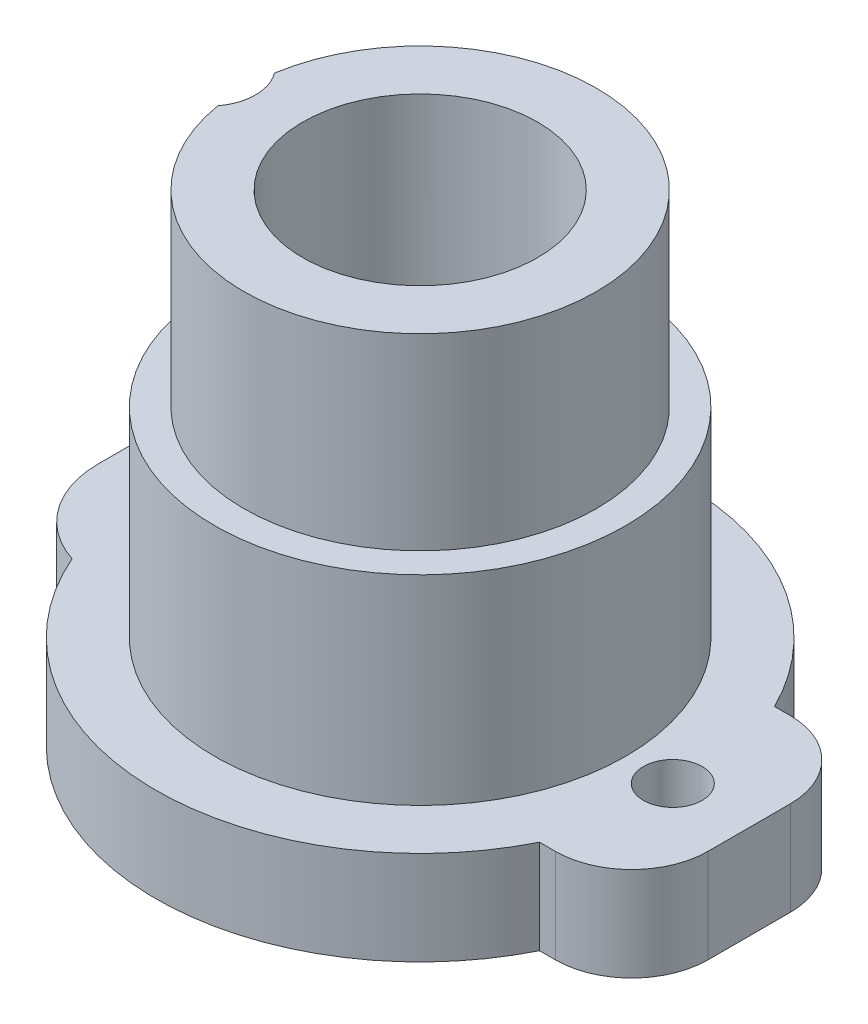
ISO-10303-21;
HEADER;
FILE_DESCRIPTION(('STEP AP214'),'2;1');
FILE_NAME('part.step','',(''),(''),'','','');
FILE_SCHEMA(('AUTOMOTIVE_DESIGN { 1 0 10303 214 1 1 1 1 }'));
ENDSEC;
DATA;
#1=APPLICATION_CONTEXT('core data for automotive mechanical design processes');
#2=APPLICATION_PROTOCOL_DEFINITION('international standard','automotive_design',2000,#1);
#3=PRODUCT_CONTEXT('',#1,'mechanical');
#4=PRODUCT('Part','Part','',(#3));
#5=PRODUCT_RELATED_PRODUCT_CATEGORY('part','',(#4));
#6=PRODUCT_DEFINITION_FORMATION('','',#4);
#7=PRODUCT_DEFINITION_CONTEXT('part definition',#1,'design');
#8=PRODUCT_DEFINITION('design','',#6,#7);
#9=PRODUCT_DEFINITION_SHAPE('','',#8);
#10=(LENGTH_UNIT() NAMED_UNIT(*) SI_UNIT(.MILLI.,.METRE.));
#11=(NAMED_UNIT(*) PLANE_ANGLE_UNIT() SI_UNIT($,.RADIAN.));
#12=(NAMED_UNIT(*) SI_UNIT($,.STERADIAN.) SOLID_ANGLE_UNIT());
#13=UNCERTAINTY_MEASURE_WITH_UNIT(LENGTH_MEASURE(1.E-05),#10,'distance_accuracy_value','');
#14=(GEOMETRIC_REPRESENTATION_CONTEXT(3) GLOBAL_UNCERTAINTY_ASSIGNED_CONTEXT((#13)) GLOBAL_UNIT_ASSIGNED_CONTEXT((#10,
#11,#12)) REPRESENTATION_CONTEXT('',''));
#15=CARTESIAN_POINT('',(0.,0.,0.));
#16=DIRECTION('',(0.,0.,1.));
#17=DIRECTION('',(1.,0.,0.));
#18=AXIS2_PLACEMENT_3D('',#15,#16,#17);
#19=CARTESIAN_POINT('',(0.,-10.,0.));
#20=DIRECTION('',(0.,-1.,0.));
#21=DIRECTION('',(0.,0.,-1.));
#22=AXIS2_PLACEMENT_3D('',#19,#20,#21);
#23=CYLINDRICAL_SURFACE('',#22,35.);
#24=CARTESIAN_POINT('',(0.,16.,0.));
#25=DIRECTION('',(0.,-1.,0.));
#26=DIRECTION('',(0.,0.,-1.));
#27=AXIS2_PLACEMENT_3D('',#24,#25,#26);
#28=CIRCLE('',#27,35.);
#29=CARTESIAN_POINT('',(-34.125,16.,-7.77717011515114));
#30=VERTEX_POINT('',#29);
#31=CARTESIAN_POINT('',(-34.125,16.,7.77717011515116));
#32=VERTEX_POINT('',#31);
#33=EDGE_CURVE('E223',#30,#32,#28,.T.);
#34=ORIENTED_EDGE('',*,*,#33,.F.);
#35=DIRECTION('',(0.,-1.,0.));
#36=VECTOR('',#35,1.);
#37=CARTESIAN_POINT('',(-34.125,41.,-7.77717011515114));
#38=LINE('',#37,#36);
#39=CARTESIAN_POINT('',(-34.125,50.,-7.77717011515114));
#40=VERTEX_POINT('',#39);
#41=EDGE_CURVE('E376',#30,#40,#38,.F.);
#42=ORIENTED_EDGE('',*,*,#41,.T.);
#43=CARTESIAN_POINT('',(0.,50.,0.));
#44=DIRECTION('',(0.,-1.,0.));
#45=DIRECTION('',(0.,0.,-1.));
#46=AXIS2_PLACEMENT_3D('',#43,#44,#45);
#47=CIRCLE('',#46,35.);
#48=CARTESIAN_POINT('',(-34.125,50.,7.77717011515114));
#49=VERTEX_POINT('',#48);
#50=EDGE_CURVE('E216',#40,#49,#47,.T.);
#51=ORIENTED_EDGE('',*,*,#50,.T.);
#52=DIRECTION('',(0.,-1.,0.));
#53=VECTOR('',#52,1.);
#54=CARTESIAN_POINT('',(-34.125,41.,7.77717011515114));
#55=LINE('',#54,#53);
#56=EDGE_CURVE('E382',#49,#32,#55,.T.);
#57=ORIENTED_EDGE('',*,*,#56,.T.);
#58=EDGE_LOOP('',(#34,#42,#51,#57));
#59=FACE_BOUND('',#58,.T.);
#60=ADVANCED_FACE('F54',(#59),#23,.T.);
#61=CARTESIAN_POINT('',(0.,-10.,0.));
#62=DIRECTION('',(0.,-1.,0.));
#63=DIRECTION('',(0.,0.,-1.));
#64=AXIS2_PLACEMENT_3D('',#61,#62,#63);
#65=CYLINDRICAL_SURFACE('',#64,30.);
#66=CARTESIAN_POINT('',(0.,50.,0.));
#67=DIRECTION('',(0.,-1.,0.));
#68=DIRECTION('',(0.,0.,-1.));
#69=AXIS2_PLACEMENT_3D('',#66,#67,#68);
#70=CIRCLE('',#69,30.);
#71=CARTESIAN_POINT('',(-29.6111111111111,50.,-4.81477920214751));
#72=VERTEX_POINT('',#71);
#73=CARTESIAN_POINT('',(-29.6111111111111,50.,4.81477920214752));
#74=VERTEX_POINT('',#73);
#75=EDGE_CURVE('E213',#72,#74,#70,.T.);
#76=ORIENTED_EDGE('',*,*,#75,.F.);
#77=DIRECTION('',(0.,-1.,0.));
#78=VECTOR('',#77,1.);
#79=CARTESIAN_POINT('',(-29.6111111111111,41.,-4.8147792021475));
#80=LINE('',#79,#78);
#81=CARTESIAN_POINT('',(-29.6111111111111,82.,-4.8147792021475));
#82=VERTEX_POINT('',#81);
#83=EDGE_CURVE('E215',#72,#82,#80,.F.);
#84=ORIENTED_EDGE('',*,*,#83,.T.);
#85=CARTESIAN_POINT('',(0.,82.,0.));
#86=DIRECTION('',(0.,-1.,0.));
#87=DIRECTION('',(0.,0.,-1.));
#88=AXIS2_PLACEMENT_3D('',#85,#86,#87);
#89=CIRCLE('',#88,30.);
#90=CARTESIAN_POINT('',(-29.6111111111111,82.,4.8147792021475));
#91=VERTEX_POINT('',#90);
#92=EDGE_CURVE('E208',#82,#91,#89,.T.);
#93=ORIENTED_EDGE('',*,*,#92,.T.);
#94=DIRECTION('',(0.,-1.,0.));
#95=VECTOR('',#94,1.);
#96=CARTESIAN_POINT('',(-29.6111111111111,41.,4.8147792021475));
#97=LINE('',#96,#95);
#98=EDGE_CURVE('E194',#91,#74,#97,.T.);
#99=ORIENTED_EDGE('',*,*,#98,.T.);
#100=EDGE_LOOP('',(#76,#84,#93,#99));
#101=FACE_BOUND('',#100,.T.);
#102=ADVANCED_FACE('F211',(#101),#65,.T.);
#103=CARTESIAN_POINT('',(30.,82.,0.));
#104=DIRECTION('',(0.,1.,0.));
#105=DIRECTION('',(0.,0.,1.));
#106=AXIS2_PLACEMENT_3D('',#103,#104,#105);
#107=PLANE('',#106);
#108=CARTESIAN_POINT('',(0.,82.,0.));
#109=DIRECTION('',(0.,-1.,0.));
#110=DIRECTION('',(0.,0.,-1.));
#111=AXIS2_PLACEMENT_3D('',#108,#109,#110);
#112=CIRCLE('',#111,20.);
#113=CARTESIAN_POINT('',(0.,82.,-20.));
#114=VERTEX_POINT('',#113);
#115=EDGE_CURVE('E212',#114,#114,#112,.T.);
#116=ORIENTED_EDGE('',*,*,#115,.T.);
#117=EDGE_LOOP('',(#116));
#118=FACE_BOUND('',#117,.T.);
#119=CARTESIAN_POINT('',(-36.,82.,0.));
#120=DIRECTION('',(0.,1.,0.));
#121=DIRECTION('',(0.,0.,1.));
#122=AXIS2_PLACEMENT_3D('',#119,#120,#121);
#123=CIRCLE('',#122,8.);
#124=EDGE_CURVE('E198',#91,#82,#123,.T.);
#125=ORIENTED_EDGE('',*,*,#124,.F.);
#126=ORIENTED_EDGE('',*,*,#92,.F.);
#127=EDGE_LOOP('',(#125,#126));
#128=FACE_BOUND('',#127,.T.);
#129=ADVANCED_FACE('F210',(#118,#128),#107,.T.);
#130=CARTESIAN_POINT('',(0.,-10.,0.));
#131=DIRECTION('',(0.,-1.,0.));
#132=DIRECTION('',(0.,0.,-1.));
#133=AXIS2_PLACEMENT_3D('',#130,#131,#132);
#134=CYLINDRICAL_SURFACE('',#133,20.);
#135=ORIENTED_EDGE('',*,*,#115,.F.);
#136=EDGE_LOOP('',(#135));
#137=FACE_BOUND('',#136,.T.);
#138=CARTESIAN_POINT('',(0.,16.,0.));
#139=DIRECTION('',(0.,1.,0.));
#140=DIRECTION('',(0.,0.,1.));
#141=AXIS2_PLACEMENT_3D('',#138,#139,#140);
#142=CIRCLE('',#141,20.);
#143=CARTESIAN_POINT('',(0.,16.,20.));
#144=VERTEX_POINT('',#143);
#145=CARTESIAN_POINT('',(0.,16.,-20.));
#146=VERTEX_POINT('',#145);
#147=EDGE_CURVE('E299',#144,#146,#142,.T.);
#148=ORIENTED_EDGE('',*,*,#147,.F.);
#149=DIRECTION('',(0.,-1.,0.));
#150=VECTOR('',#149,1.);
#151=CARTESIAN_POINT('',(0.,16.,20.));
#152=LINE('',#151,#150);
#153=CARTESIAN_POINT('',(0.,0.,20.));
#154=VERTEX_POINT('',#153);
#155=EDGE_CURVE('E300',#144,#154,#152,.T.);
#156=ORIENTED_EDGE('',*,*,#155,.T.);
#157=CARTESIAN_POINT('',(0.,0.,0.));
#158=DIRECTION('',(0.,-1.,0.));
#159=DIRECTION('',(0.,0.,-1.));
#160=AXIS2_PLACEMENT_3D('',#157,#158,#159);
#161=CIRCLE('',#160,20.);
#162=CARTESIAN_POINT('',(-8.71779788708134,0.,18.));
#163=VERTEX_POINT('',#162);
#164=EDGE_CURVE('E237',#154,#163,#161,.T.);
#165=ORIENTED_EDGE('',*,*,#164,.T.);
#166=DIRECTION('',(0.,-1.,0.));
#167=VECTOR('',#166,1.);
#168=CARTESIAN_POINT('',(-8.71779788708134,-10.,18.));
#169=LINE('',#168,#167);
#170=CARTESIAN_POINT('',(-8.71779788708134,16.,18.));
#171=VERTEX_POINT('',#170);
#172=EDGE_CURVE('E218',#163,#171,#169,.F.);
#173=ORIENTED_EDGE('',*,*,#172,.T.);
#174=CARTESIAN_POINT('',(0.,16.,0.));
#175=DIRECTION('',(0.,1.,0.));
#176=DIRECTION('',(0.,0.,1.));
#177=AXIS2_PLACEMENT_3D('',#174,#175,#176);
#178=CIRCLE('',#177,20.);
#179=CARTESIAN_POINT('',(-8.71779788708134,16.,-18.));
#180=VERTEX_POINT('',#179);
#181=EDGE_CURVE('E335',#180,#171,#178,.T.);
#182=ORIENTED_EDGE('',*,*,#181,.F.);
#183=DIRECTION('',(0.,-1.,0.));
#184=VECTOR('',#183,1.);
#185=CARTESIAN_POINT('',(-8.71779788708134,-10.,-18.));
#186=LINE('',#185,#184);
#187=CARTESIAN_POINT('',(-8.71779788708134,0.,-18.));
#188=VERTEX_POINT('',#187);
#189=EDGE_CURVE('E336',#180,#188,#186,.T.);
#190=ORIENTED_EDGE('',*,*,#189,.T.);
#191=CARTESIAN_POINT('',(0.,0.,-20.));
#192=VERTEX_POINT('',#191);
#193=EDGE_CURVE('E240',#188,#192,#161,.T.);
#194=ORIENTED_EDGE('',*,*,#193,.T.);
#195=DIRECTION('',(0.,-1.,0.));
#196=VECTOR('',#195,1.);
#197=CARTESIAN_POINT('',(0.,16.,-20.));
#198=LINE('',#197,#196);
#199=EDGE_CURVE('E280',#146,#192,#198,.T.);
#200=ORIENTED_EDGE('',*,*,#199,.F.);
#201=EDGE_LOOP('',(#148,#156,#165,#173,#182,#190,#194,#200));
#202=FACE_BOUND('',#201,.T.);
#203=ADVANCED_FACE('F341',(#137,#202),#134,.F.);
#204=CARTESIAN_POINT('',(0.,-10.,0.));
#205=DIRECTION('',(0.,-1.,0.));
#206=DIRECTION('',(0.,0.,-1.));
#207=AXIS2_PLACEMENT_3D('',#204,#205,#206);
#208=CYLINDRICAL_SURFACE('',#207,45.);
#209=CARTESIAN_POINT('',(0.,0.,0.));
#210=DIRECTION('',(0.,-1.,0.));
#211=DIRECTION('',(0.,0.,-1.));
#212=AXIS2_PLACEMENT_3D('',#209,#210,#211);
#213=CIRCLE('',#212,45.);
#214=CARTESIAN_POINT('',(40.3112887414928,0.,20.));
#215=VERTEX_POINT('',#214);
#216=CARTESIAN_POINT('',(-41.2431812546026,0.,18.));
#217=VERTEX_POINT('',#216);
#218=EDGE_CURVE('E234',#215,#217,#213,.T.);
#219=ORIENTED_EDGE('',*,*,#218,.F.);
#220=DIRECTION('',(0.,-1.,0.));
#221=VECTOR('',#220,1.);
#222=CARTESIAN_POINT('',(40.3112887414928,-10.,20.));
#223=LINE('',#222,#221);
#224=CARTESIAN_POINT('',(40.3112887414928,16.,20.));
#225=VERTEX_POINT('',#224);
#226=EDGE_CURVE('E305',#215,#225,#223,.F.);
#227=ORIENTED_EDGE('',*,*,#226,.T.);
#228=CARTESIAN_POINT('',(0.,16.,0.));
#229=DIRECTION('',(0.,-1.,0.));
#230=DIRECTION('',(0.,0.,-1.));
#231=AXIS2_PLACEMENT_3D('',#228,#229,#230);
#232=CIRCLE('',#231,45.);
#233=CARTESIAN_POINT('',(-41.2431812546026,16.,18.));
#234=VERTEX_POINT('',#233);
#235=EDGE_CURVE('E226',#225,#234,#232,.T.);
#236=ORIENTED_EDGE('',*,*,#235,.T.);
#237=DIRECTION('',(0.,-1.,0.));
#238=VECTOR('',#237,1.);
#239=CARTESIAN_POINT('',(-41.2431812546026,-10.,18.));
#240=LINE('',#239,#238);
#241=EDGE_CURVE('E337',#234,#217,#240,.T.);
#242=ORIENTED_EDGE('',*,*,#241,.T.);
#243=EDGE_LOOP('',(#219,#227,#236,#242));
#244=FACE_BOUND('',#243,.T.);
#245=ADVANCED_FACE('F414',(#244),#208,.T.);
#246=CARTESIAN_POINT('',(-41.2431812546026,16.,-18.));
#247=VERTEX_POINT('',#246);
#248=CARTESIAN_POINT('',(40.3112887414928,16.,-20.));
#249=VERTEX_POINT('',#248);
#250=EDGE_CURVE('E229',#247,#249,#232,.T.);
#251=ORIENTED_EDGE('',*,*,#250,.T.);
#252=DIRECTION('',(0.,-1.,0.));
#253=VECTOR('',#252,1.);
#254=CARTESIAN_POINT('',(40.3112887414928,-10.,-20.));
#255=LINE('',#254,#253);
#256=CARTESIAN_POINT('',(40.3112887414928,0.,-20.));
#257=VERTEX_POINT('',#256);
#258=EDGE_CURVE('E277',#249,#257,#255,.T.);
#259=ORIENTED_EDGE('',*,*,#258,.T.);
#260=CARTESIAN_POINT('',(-41.2431812546026,0.,-18.));
#261=VERTEX_POINT('',#260);
#262=EDGE_CURVE('E235',#261,#257,#213,.T.);
#263=ORIENTED_EDGE('',*,*,#262,.F.);
#264=DIRECTION('',(0.,-1.,0.));
#265=VECTOR('',#264,1.);
#266=CARTESIAN_POINT('',(-41.2431812546026,-10.,-18.));
#267=LINE('',#266,#265);
#268=EDGE_CURVE('E333',#261,#247,#267,.F.);
#269=ORIENTED_EDGE('',*,*,#268,.T.);
#270=EDGE_LOOP('',(#251,#259,#263,#269));
#271=FACE_BOUND('',#270,.T.);
#272=ADVANCED_FACE('F413',(#271),#208,.T.);
#273=CARTESIAN_POINT('',(20.,0.,0.));
#274=DIRECTION('',(0.,-1.,0.));
#275=DIRECTION('',(0.,0.,-1.));
#276=AXIS2_PLACEMENT_3D('',#273,#274,#275);
#277=PLANE('',#276);
#278=CARTESIAN_POINT('',(43.,0.,0.));
#279=DIRECTION('',(0.,1.,0.));
#280=DIRECTION('',(0.,0.,1.));
#281=AXIS2_PLACEMENT_3D('',#278,#279,#280);
#282=CIRCLE('',#281,5.);
#283=CARTESIAN_POINT('',(43.,0.,5.));
#284=VERTEX_POINT('',#283);
#285=EDGE_CURVE('E241',#284,#284,#282,.T.);
#286=ORIENTED_EDGE('',*,*,#285,.T.);
#287=EDGE_LOOP('',(#286));
#288=FACE_BOUND('',#287,.T.);
#289=CARTESIAN_POINT('',(-36.,0.,0.));
#290=DIRECTION('',(0.,1.,0.));
#291=DIRECTION('',(0.,0.,1.));
#292=AXIS2_PLACEMENT_3D('',#289,#290,#291);
#293=CIRCLE('',#292,8.);
#294=CARTESIAN_POINT('',(-36.,0.,8.));
#295=VERTEX_POINT('',#294);
#296=EDGE_CURVE('E207',#295,#295,#293,.T.);
#297=ORIENTED_EDGE('',*,*,#296,.T.);
#298=EDGE_LOOP('',(#297));
#299=FACE_BOUND('',#298,.T.);
#300=ORIENTED_EDGE('',*,*,#164,.F.);
#301=DIRECTION('',(0.,0.,1.));
#302=VECTOR('',#301,1.);
#303=CARTESIAN_POINT('',(0.,0.,-20.));
#304=LINE('',#303,#302);
#305=CARTESIAN_POINT('',(0.,0.,18.));
#306=VERTEX_POINT('',#305);
#307=EDGE_CURVE('E367',#306,#154,#304,.T.);
#308=ORIENTED_EDGE('',*,*,#307,.F.);
#309=DIRECTION('',(1.,0.,0.));
#310=VECTOR('',#309,1.);
#311=CARTESIAN_POINT('',(-53.,0.,18.));
#312=LINE('',#311,#310);
#313=EDGE_CURVE('E319',#163,#306,#312,.T.);
#314=ORIENTED_EDGE('',*,*,#313,.F.);
#315=EDGE_LOOP('',(#300,#308,#314));
#316=FACE_BOUND('',#315,.T.);
#317=CARTESIAN_POINT('',(0.,0.,-18.));
#318=VERTEX_POINT('',#317);
#319=EDGE_CURVE('E292',#192,#318,#304,.T.);
#320=ORIENTED_EDGE('',*,*,#319,.F.);
#321=ORIENTED_EDGE('',*,*,#193,.F.);
#322=DIRECTION('',(-1.,0.,0.));
#323=VECTOR('',#322,1.);
#324=CARTESIAN_POINT('',(-53.,0.,-18.));
#325=LINE('',#324,#323);
#326=EDGE_CURVE('E313',#318,#188,#325,.T.);
#327=ORIENTED_EDGE('',*,*,#326,.F.);
#328=EDGE_LOOP('',(#320,#321,#327));
#329=FACE_BOUND('',#328,.T.);
#330=DIRECTION('',(-1.,0.,0.));
#331=VECTOR('',#330,1.);
#332=CARTESIAN_POINT('',(0.,0.,-20.));
#333=LINE('',#332,#331);
#334=CARTESIAN_POINT('',(43.,0.,-20.));
#335=VERTEX_POINT('',#334);
#336=EDGE_CURVE('E284',#335,#257,#333,.T.);
#337=ORIENTED_EDGE('',*,*,#336,.F.);
#338=CARTESIAN_POINT('',(43.,0.,-7.));
#339=DIRECTION('',(0.,-1.,0.));
#340=DIRECTION('',(0.,0.,-1.));
#341=AXIS2_PLACEMENT_3D('',#338,#339,#340);
#342=CIRCLE('',#341,13.);
#343=CARTESIAN_POINT('',(56.,0.,-7.));
#344=VERTEX_POINT('',#343);
#345=EDGE_CURVE('E255',#335,#344,#342,.T.);
#346=ORIENTED_EDGE('',*,*,#345,.T.);
#347=DIRECTION('',(0.,0.,-1.));
#348=VECTOR('',#347,1.);
#349=CARTESIAN_POINT('',(56.,0.,-20.));
#350=LINE('',#349,#348);
#351=CARTESIAN_POINT('',(56.,0.,7.));
#352=VERTEX_POINT('',#351);
#353=EDGE_CURVE('E281',#352,#344,#350,.T.);
#354=ORIENTED_EDGE('',*,*,#353,.F.);
#355=CARTESIAN_POINT('',(43.,0.,7.));
#356=DIRECTION('',(0.,-1.,0.));
#357=DIRECTION('',(0.,0.,-1.));
#358=AXIS2_PLACEMENT_3D('',#355,#356,#357);
#359=CIRCLE('',#358,13.);
#360=CARTESIAN_POINT('',(43.,0.,20.));
#361=VERTEX_POINT('',#360);
#362=EDGE_CURVE('E252',#352,#361,#359,.T.);
#363=ORIENTED_EDGE('',*,*,#362,.T.);
#364=DIRECTION('',(1.,0.,0.));
#365=VECTOR('',#364,1.);
#366=CARTESIAN_POINT('',(0.,0.,20.));
#367=LINE('',#366,#365);
#368=EDGE_CURVE('E289',#215,#361,#367,.T.);
#369=ORIENTED_EDGE('',*,*,#368,.F.);
#370=ORIENTED_EDGE('',*,*,#218,.T.);
#371=CARTESIAN_POINT('',(-36.,0.,1.82875854081127));
#372=DIRECTION('',(0.,-1.,0.));
#373=DIRECTION('',(0.,0.,-1.));
#374=AXIS2_PLACEMENT_3D('',#371,#372,#373);
#375=CIRCLE('',#374,17.);
#376=CARTESIAN_POINT('',(-53.,0.,1.82875854081127));
#377=VERTEX_POINT('',#376);
#378=EDGE_CURVE('E239',#217,#377,#375,.T.);
#379=ORIENTED_EDGE('',*,*,#378,.T.);
#380=DIRECTION('',(0.,0.,1.));
#381=VECTOR('',#380,1.);
#382=CARTESIAN_POINT('',(-53.,0.,-18.));
#383=LINE('',#382,#381);
#384=CARTESIAN_POINT('',(-53.,0.,-18.));
#385=VERTEX_POINT('',#384);
#386=EDGE_CURVE('E308',#385,#377,#383,.T.);
#387=ORIENTED_EDGE('',*,*,#386,.F.);
#388=EDGE_CURVE('E325',#261,#385,#325,.T.);
#389=ORIENTED_EDGE('',*,*,#388,.F.);
#390=ORIENTED_EDGE('',*,*,#262,.T.);
#391=EDGE_LOOP('',(#337,#346,#354,#363,#369,#370,#379,#387,#389,#390));
#392=FACE_BOUND('',#391,.T.);
#393=ADVANCED_FACE('F285',(#288,#299,#316,#329,#392),#277,.T.);
#394=CARTESIAN_POINT('',(45.,16.,0.));
#395=DIRECTION('',(0.,1.,0.));
#396=DIRECTION('',(0.,0.,1.));
#397=AXIS2_PLACEMENT_3D('',#394,#395,#396);
#398=PLANE('',#397);
#399=CARTESIAN_POINT('',(43.,16.,0.));
#400=DIRECTION('',(0.,1.,0.));
#401=DIRECTION('',(0.,0.,1.));
#402=AXIS2_PLACEMENT_3D('',#399,#400,#401);
#403=CIRCLE('',#402,5.);
#404=CARTESIAN_POINT('',(43.,16.,5.));
#405=VERTEX_POINT('',#404);
#406=EDGE_CURVE('E238',#405,#405,#403,.F.);
#407=ORIENTED_EDGE('',*,*,#406,.T.);
#408=EDGE_LOOP('',(#407));
#409=FACE_BOUND('',#408,.T.);
#410=DIRECTION('',(0.,0.,-1.));
#411=VECTOR('',#410,1.);
#412=CARTESIAN_POINT('',(56.,16.,-20.));
#413=LINE('',#412,#411);
#414=CARTESIAN_POINT('',(56.,16.,7.));
#415=VERTEX_POINT('',#414);
#416=CARTESIAN_POINT('',(56.,16.,-7.));
#417=VERTEX_POINT('',#416);
#418=EDGE_CURVE('E267',#415,#417,#413,.T.);
#419=ORIENTED_EDGE('',*,*,#418,.T.);
#420=CARTESIAN_POINT('',(43.,16.,-7.));
#421=DIRECTION('',(0.,1.,0.));
#422=DIRECTION('',(0.,0.,1.));
#423=AXIS2_PLACEMENT_3D('',#420,#421,#422);
#424=CIRCLE('',#423,13.);
#425=CARTESIAN_POINT('',(43.,16.,-20.));
#426=VERTEX_POINT('',#425);
#427=EDGE_CURVE('E61',#417,#426,#424,.T.);
#428=ORIENTED_EDGE('',*,*,#427,.T.);
#429=DIRECTION('',(-1.,0.,0.));
#430=VECTOR('',#429,1.);
#431=CARTESIAN_POINT('',(0.,16.,-20.));
#432=LINE('',#431,#430);
#433=EDGE_CURVE('E270',#426,#249,#432,.T.);
#434=ORIENTED_EDGE('',*,*,#433,.T.);
#435=ORIENTED_EDGE('',*,*,#250,.F.);
#436=DIRECTION('',(-1.,0.,0.));
#437=VECTOR('',#436,1.);
#438=CARTESIAN_POINT('',(-53.,16.,-18.));
#439=LINE('',#438,#437);
#440=CARTESIAN_POINT('',(-53.,16.,-18.));
#441=VERTEX_POINT('',#440);
#442=EDGE_CURVE('E311',#247,#441,#439,.T.);
#443=ORIENTED_EDGE('',*,*,#442,.T.);
#444=DIRECTION('',(0.,0.,1.));
#445=VECTOR('',#444,1.);
#446=CARTESIAN_POINT('',(-53.,16.,-18.));
#447=LINE('',#446,#445);
#448=CARTESIAN_POINT('',(-53.,16.,1.82875854081127));
#449=VERTEX_POINT('',#448);
#450=EDGE_CURVE('E307',#441,#449,#447,.T.);
#451=ORIENTED_EDGE('',*,*,#450,.T.);
#452=CARTESIAN_POINT('',(-36.,16.,1.82875854081127));
#453=DIRECTION('',(0.,1.,0.));
#454=DIRECTION('',(0.,0.,1.));
#455=AXIS2_PLACEMENT_3D('',#452,#453,#454);
#456=CIRCLE('',#455,17.);
#457=EDGE_CURVE('E249',#449,#234,#456,.T.);
#458=ORIENTED_EDGE('',*,*,#457,.T.);
#459=ORIENTED_EDGE('',*,*,#235,.F.);
#460=DIRECTION('',(1.,0.,0.));
#461=VECTOR('',#460,1.);
#462=CARTESIAN_POINT('',(0.,16.,20.));
#463=LINE('',#462,#461);
#464=CARTESIAN_POINT('',(43.,16.,20.));
#465=VERTEX_POINT('',#464);
#466=EDGE_CURVE('E365',#225,#465,#463,.T.);
#467=ORIENTED_EDGE('',*,*,#466,.T.);
#468=CARTESIAN_POINT('',(43.,16.,7.));
#469=DIRECTION('',(0.,1.,0.));
#470=DIRECTION('',(0.,0.,1.));
#471=AXIS2_PLACEMENT_3D('',#468,#469,#470);
#472=CIRCLE('',#471,13.);
#473=EDGE_CURVE('E257',#465,#415,#472,.T.);
#474=ORIENTED_EDGE('',*,*,#473,.T.);
#475=EDGE_LOOP('',(#419,#428,#434,#435,#443,#451,#458,#459,#467,#474));
#476=FACE_BOUND('',#475,.T.);
#477=ORIENTED_EDGE('',*,*,#33,.T.);
#478=CARTESIAN_POINT('',(-36.,16.,0.));
#479=DIRECTION('',(0.,1.,0.));
#480=DIRECTION('',(0.,0.,1.));
#481=AXIS2_PLACEMENT_3D('',#478,#479,#480);
#482=CIRCLE('',#481,8.);
#483=EDGE_CURVE('E381',#32,#30,#482,.F.);
#484=ORIENTED_EDGE('',*,*,#483,.T.);
#485=EDGE_LOOP('',(#477,#484));
#486=FACE_BOUND('',#485,.T.);
#487=ADVANCED_FACE('F262',(#409,#476,#486),#398,.T.);
#488=CARTESIAN_POINT('',(35.,50.,0.));
#489=DIRECTION('',(0.,1.,0.));
#490=DIRECTION('',(0.,0.,1.));
#491=AXIS2_PLACEMENT_3D('',#488,#489,#490);
#492=PLANE('',#491);
#493=ORIENTED_EDGE('',*,*,#50,.F.);
#494=CARTESIAN_POINT('',(-36.,50.,0.));
#495=DIRECTION('',(0.,1.,0.));
#496=DIRECTION('',(0.,0.,1.));
#497=AXIS2_PLACEMENT_3D('',#494,#495,#496);
#498=CIRCLE('',#497,8.);
#499=EDGE_CURVE('E372',#40,#72,#498,.F.);
#500=ORIENTED_EDGE('',*,*,#499,.T.);
#501=ORIENTED_EDGE('',*,*,#75,.T.);
#502=EDGE_CURVE('E200',#74,#49,#498,.F.);
#503=ORIENTED_EDGE('',*,*,#502,.T.);
#504=EDGE_LOOP('',(#493,#500,#501,#503));
#505=FACE_BOUND('',#504,.T.);
#506=ADVANCED_FACE('F386',(#505),#492,.T.);
#507=CARTESIAN_POINT('',(-53.,16.,-18.));
#508=DIRECTION('',(1.,0.,0.));
#509=DIRECTION('',(0.,0.,-1.));
#510=AXIS2_PLACEMENT_3D('',#507,#508,#509);
#511=PLANE('',#510);
#512=ORIENTED_EDGE('',*,*,#386,.T.);
#513=DIRECTION('',(0.,-1.,0.));
#514=VECTOR('',#513,1.);
#515=CARTESIAN_POINT('',(-53.,16.,1.82875854081127));
#516=LINE('',#515,#514);
#517=EDGE_CURVE('E242',#377,#449,#516,.F.);
#518=ORIENTED_EDGE('',*,*,#517,.T.);
#519=ORIENTED_EDGE('',*,*,#450,.F.);
#520=DIRECTION('',(0.,-1.,0.));
#521=VECTOR('',#520,1.);
#522=CARTESIAN_POINT('',(-53.,16.,-18.));
#523=LINE('',#522,#521);
#524=EDGE_CURVE('E320',#441,#385,#523,.T.);
#525=ORIENTED_EDGE('',*,*,#524,.T.);
#526=EDGE_LOOP('',(#512,#518,#519,#525));
#527=FACE_BOUND('',#526,.T.);
#528=ADVANCED_FACE('F393',(#527),#511,.F.);
#529=CARTESIAN_POINT('',(-53.,16.,-18.));
#530=DIRECTION('',(0.,0.,1.));
#531=DIRECTION('',(1.,0.,0.));
#532=AXIS2_PLACEMENT_3D('',#529,#530,#531);
#533=PLANE('',#532);
#534=ORIENTED_EDGE('',*,*,#268,.F.);
#535=ORIENTED_EDGE('',*,*,#388,.T.);
#536=ORIENTED_EDGE('',*,*,#524,.F.);
#537=ORIENTED_EDGE('',*,*,#442,.F.);
#538=EDGE_LOOP('',(#534,#535,#536,#537));
#539=FACE_BOUND('',#538,.T.);
#540=ADVANCED_FACE('F400',(#539),#533,.F.);
#541=CARTESIAN_POINT('',(-53.,16.,18.));
#542=DIRECTION('',(0.,0.,-1.));
#543=DIRECTION('',(-1.,0.,0.));
#544=AXIS2_PLACEMENT_3D('',#541,#542,#543);
#545=PLANE('',#544);
#546=ORIENTED_EDGE('',*,*,#172,.F.);
#547=ORIENTED_EDGE('',*,*,#313,.T.);
#548=DIRECTION('',(0.,-1.,0.));
#549=VECTOR('',#548,1.);
#550=CARTESIAN_POINT('',(0.,16.,18.));
#551=LINE('',#550,#549);
#552=CARTESIAN_POINT('',(0.,16.,18.));
#553=VERTEX_POINT('',#552);
#554=EDGE_CURVE('E328',#553,#306,#551,.T.);
#555=ORIENTED_EDGE('',*,*,#554,.F.);
#556=DIRECTION('',(1.,0.,0.));
#557=VECTOR('',#556,1.);
#558=CARTESIAN_POINT('',(-53.,16.,18.));
#559=LINE('',#558,#557);
#560=EDGE_CURVE('E309',#171,#553,#559,.T.);
#561=ORIENTED_EDGE('',*,*,#560,.F.);
#562=EDGE_LOOP('',(#546,#547,#555,#561));
#563=FACE_BOUND('',#562,.T.);
#564=ADVANCED_FACE('F352',(#563),#545,.F.);
#565=ORIENTED_EDGE('',*,*,#189,.F.);
#566=CARTESIAN_POINT('',(0.,16.,-18.));
#567=VERTEX_POINT('',#566);
#568=EDGE_CURVE('E314',#567,#180,#439,.T.);
#569=ORIENTED_EDGE('',*,*,#568,.F.);
#570=DIRECTION('',(0.,-1.,0.));
#571=VECTOR('',#570,1.);
#572=CARTESIAN_POINT('',(0.,16.,-18.));
#573=LINE('',#572,#571);
#574=EDGE_CURVE('E330',#567,#318,#573,.T.);
#575=ORIENTED_EDGE('',*,*,#574,.T.);
#576=ORIENTED_EDGE('',*,*,#326,.T.);
#577=EDGE_LOOP('',(#565,#569,#575,#576));
#578=FACE_BOUND('',#577,.T.);
#579=ADVANCED_FACE('F469',(#578),#533,.F.);
#580=CARTESIAN_POINT('',(0.,16.,0.));
#581=DIRECTION('',(0.,1.,0.));
#582=DIRECTION('',(0.,0.,1.));
#583=AXIS2_PLACEMENT_3D('',#580,#581,#582);
#584=PLANE('',#583);
#585=ORIENTED_EDGE('',*,*,#568,.T.);
#586=ORIENTED_EDGE('',*,*,#181,.T.);
#587=ORIENTED_EDGE('',*,*,#560,.T.);
#588=DIRECTION('',(0.,0.,1.));
#589=VECTOR('',#588,1.);
#590=CARTESIAN_POINT('',(0.,16.,-20.));
#591=LINE('',#590,#589);
#592=EDGE_CURVE('E286',#553,#144,#591,.T.);
#593=ORIENTED_EDGE('',*,*,#592,.T.);
#594=ORIENTED_EDGE('',*,*,#147,.T.);
#595=EDGE_CURVE('E362',#146,#567,#591,.T.);
#596=ORIENTED_EDGE('',*,*,#595,.T.);
#597=EDGE_LOOP('',(#585,#586,#587,#593,#594,#596));
#598=FACE_BOUND('',#597,.T.);
#599=ADVANCED_FACE('F353',(#598),#584,.T.);
#600=CARTESIAN_POINT('',(0.,16.,-20.));
#601=DIRECTION('',(0.,0.,1.));
#602=DIRECTION('',(1.,0.,0.));
#603=AXIS2_PLACEMENT_3D('',#600,#601,#602);
#604=PLANE('',#603);
#605=ORIENTED_EDGE('',*,*,#433,.F.);
#606=DIRECTION('',(0.,-1.,0.));
#607=VECTOR('',#606,1.);
#608=CARTESIAN_POINT('',(43.,16.,-20.));
#609=LINE('',#608,#607);
#610=EDGE_CURVE('E246',#426,#335,#609,.T.);
#611=ORIENTED_EDGE('',*,*,#610,.T.);
#612=ORIENTED_EDGE('',*,*,#336,.T.);
#613=ORIENTED_EDGE('',*,*,#258,.F.);
#614=EDGE_LOOP('',(#605,#611,#612,#613));
#615=FACE_BOUND('',#614,.T.);
#616=ADVANCED_FACE('F272',(#615),#604,.F.);
#617=CARTESIAN_POINT('',(56.,16.,-20.));
#618=DIRECTION('',(-1.,0.,0.));
#619=DIRECTION('',(0.,0.,1.));
#620=AXIS2_PLACEMENT_3D('',#617,#618,#619);
#621=PLANE('',#620);
#622=ORIENTED_EDGE('',*,*,#353,.T.);
#623=DIRECTION('',(0.,-1.,0.));
#624=VECTOR('',#623,1.);
#625=CARTESIAN_POINT('',(56.,16.,-7.));
#626=LINE('',#625,#624);
#627=EDGE_CURVE('E78',#344,#417,#626,.F.);
#628=ORIENTED_EDGE('',*,*,#627,.T.);
#629=ORIENTED_EDGE('',*,*,#418,.F.);
#630=DIRECTION('',(0.,-1.,0.));
#631=VECTOR('',#630,1.);
#632=CARTESIAN_POINT('',(56.,16.,7.));
#633=LINE('',#632,#631);
#634=EDGE_CURVE('E258',#415,#352,#633,.T.);
#635=ORIENTED_EDGE('',*,*,#634,.T.);
#636=EDGE_LOOP('',(#622,#628,#629,#635));
#637=FACE_BOUND('',#636,.T.);
#638=ADVANCED_FACE('F282',(#637),#621,.F.);
#639=CARTESIAN_POINT('',(0.,16.,20.));
#640=DIRECTION('',(0.,0.,-1.));
#641=DIRECTION('',(-1.,0.,0.));
#642=AXIS2_PLACEMENT_3D('',#639,#640,#641);
#643=PLANE('',#642);
#644=ORIENTED_EDGE('',*,*,#368,.T.);
#645=DIRECTION('',(0.,-1.,0.));
#646=VECTOR('',#645,1.);
#647=CARTESIAN_POINT('',(43.,16.,20.));
#648=LINE('',#647,#646);
#649=EDGE_CURVE('E13',#361,#465,#648,.F.);
#650=ORIENTED_EDGE('',*,*,#649,.T.);
#651=ORIENTED_EDGE('',*,*,#466,.F.);
#652=ORIENTED_EDGE('',*,*,#226,.F.);
#653=EDGE_LOOP('',(#644,#650,#651,#652));
#654=FACE_BOUND('',#653,.T.);
#655=ADVANCED_FACE('F437',(#654),#643,.F.);
#656=CARTESIAN_POINT('',(0.,16.,-20.));
#657=DIRECTION('',(1.,0.,0.));
#658=DIRECTION('',(0.,0.,-1.));
#659=AXIS2_PLACEMENT_3D('',#656,#657,#658);
#660=PLANE('',#659);
#661=ORIENTED_EDGE('',*,*,#592,.F.);
#662=ORIENTED_EDGE('',*,*,#554,.T.);
#663=ORIENTED_EDGE('',*,*,#307,.T.);
#664=ORIENTED_EDGE('',*,*,#155,.F.);
#665=EDGE_LOOP('',(#661,#662,#663,#664));
#666=FACE_BOUND('',#665,.T.);
#667=ADVANCED_FACE('F363',(#666),#660,.F.);
#668=ORIENTED_EDGE('',*,*,#574,.F.);
#669=ORIENTED_EDGE('',*,*,#595,.F.);
#670=ORIENTED_EDGE('',*,*,#199,.T.);
#671=ORIENTED_EDGE('',*,*,#319,.T.);
#672=EDGE_LOOP('',(#668,#669,#670,#671));
#673=FACE_BOUND('',#672,.T.);
#674=ADVANCED_FACE('F491',(#673),#660,.F.);
#675=CARTESIAN_POINT('',(-36.,82.,0.));
#676=DIRECTION('',(0.,-1.,0.));
#677=DIRECTION('',(0.,0.,-1.));
#678=AXIS2_PLACEMENT_3D('',#675,#676,#677);
#679=CYLINDRICAL_SURFACE('',#678,8.);
#680=ORIENTED_EDGE('',*,*,#499,.F.);
#681=ORIENTED_EDGE('',*,*,#41,.F.);
#682=ORIENTED_EDGE('',*,*,#483,.F.);
#683=ORIENTED_EDGE('',*,*,#56,.F.);
#684=ORIENTED_EDGE('',*,*,#502,.F.);
#685=ORIENTED_EDGE('',*,*,#98,.F.);
#686=ORIENTED_EDGE('',*,*,#124,.T.);
#687=ORIENTED_EDGE('',*,*,#83,.F.);
#688=EDGE_LOOP('',(#680,#681,#682,#683,#684,#685,#686,#687));
#689=FACE_BOUND('',#688,.T.);
#690=ORIENTED_EDGE('',*,*,#296,.F.);
#691=EDGE_LOOP('',(#690));
#692=FACE_BOUND('',#691,.T.);
#693=ADVANCED_FACE('F191',(#689,#692),#679,.F.);
#694=CARTESIAN_POINT('',(43.,82.,0.));
#695=DIRECTION('',(0.,-1.,0.));
#696=DIRECTION('',(0.,0.,-1.));
#697=AXIS2_PLACEMENT_3D('',#694,#695,#696);
#698=CYLINDRICAL_SURFACE('',#697,5.);
#699=ORIENTED_EDGE('',*,*,#406,.F.);
#700=EDGE_LOOP('',(#699));
#701=FACE_BOUND('',#700,.T.);
#702=ORIENTED_EDGE('',*,*,#285,.F.);
#703=EDGE_LOOP('',(#702));
#704=FACE_BOUND('',#703,.T.);
#705=ADVANCED_FACE('F422',(#701,#704),#698,.F.);
#706=CARTESIAN_POINT('',(-36.,-10.,1.82875854081127));
#707=DIRECTION('',(0.,-1.,0.));
#708=DIRECTION('',(0.,0.,-1.));
#709=AXIS2_PLACEMENT_3D('',#706,#707,#708);
#710=CYLINDRICAL_SURFACE('',#709,17.);
#711=ORIENTED_EDGE('',*,*,#457,.F.);
#712=ORIENTED_EDGE('',*,*,#517,.F.);
#713=ORIENTED_EDGE('',*,*,#378,.F.);
#714=ORIENTED_EDGE('',*,*,#241,.F.);
#715=EDGE_LOOP('',(#711,#712,#713,#714));
#716=FACE_BOUND('',#715,.T.);
#717=ADVANCED_FACE('F421',(#716),#710,.T.);
#718=CARTESIAN_POINT('',(43.,16.,-7.));
#719=DIRECTION('',(0.,-1.,0.));
#720=DIRECTION('',(0.,0.,-1.));
#721=AXIS2_PLACEMENT_3D('',#718,#719,#720);
#722=CYLINDRICAL_SURFACE('',#721,13.);
#723=ORIENTED_EDGE('',*,*,#427,.F.);
#724=ORIENTED_EDGE('',*,*,#627,.F.);
#725=ORIENTED_EDGE('',*,*,#345,.F.);
#726=ORIENTED_EDGE('',*,*,#610,.F.);
#727=EDGE_LOOP('',(#723,#724,#725,#726));
#728=FACE_BOUND('',#727,.T.);
#729=ADVANCED_FACE('F276',(#728),#722,.T.);
#730=CARTESIAN_POINT('',(43.,16.,7.));
#731=DIRECTION('',(0.,-1.,0.));
#732=DIRECTION('',(0.,0.,-1.));
#733=AXIS2_PLACEMENT_3D('',#730,#731,#732);
#734=CYLINDRICAL_SURFACE('',#733,13.);
#735=ORIENTED_EDGE('',*,*,#473,.F.);
#736=ORIENTED_EDGE('',*,*,#649,.F.);
#737=ORIENTED_EDGE('',*,*,#362,.F.);
#738=ORIENTED_EDGE('',*,*,#634,.F.);
#739=EDGE_LOOP('',(#735,#736,#737,#738));
#740=FACE_BOUND('',#739,.T.);
#741=ADVANCED_FACE('F60',(#740),#734,.T.);
#742=CLOSED_SHELL('',(#60,#102,#129,#203,#245,#272,#393,#487,#506,#528,#540,#564,#579,#599,#616,
#638,#655,#667,#674,#693,#705,#717,#729,#741));
#743=MANIFOLD_SOLID_BREP('B2',#742);
#744=ADVANCED_BREP_SHAPE_REPRESENTATION('',(#18,#743),#14);
#745=SHAPE_DEFINITION_REPRESENTATION(#9,#744);
ENDSEC;
END-ISO-10303-21;
